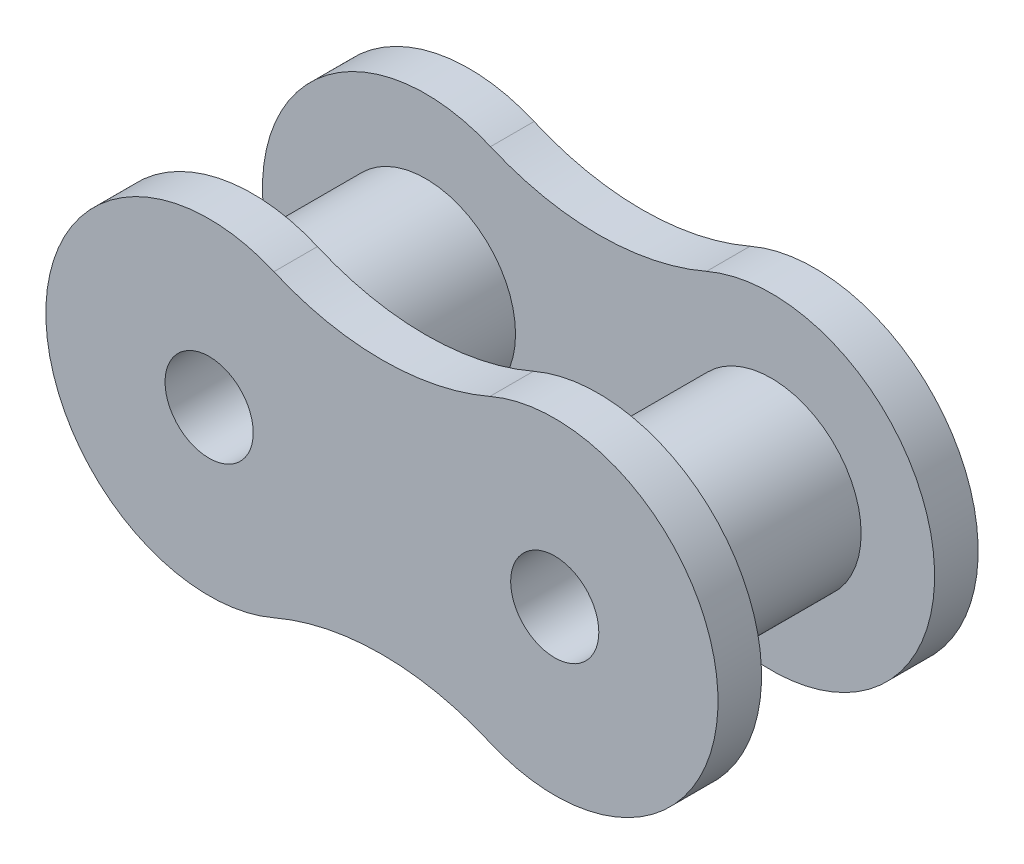
ISO-10303-21;
HEADER;
FILE_DESCRIPTION(('STEP AP214'),'2;1');
FILE_NAME('part.step','',(''),(''),'','','');
FILE_SCHEMA(('AUTOMOTIVE_DESIGN { 1 0 10303 214 1 1 1 1 }'));
ENDSEC;
DATA;
#1=APPLICATION_CONTEXT('core data for automotive mechanical design processes');
#2=APPLICATION_PROTOCOL_DEFINITION('international standard','automotive_design',2000,#1);
#3=PRODUCT_CONTEXT('',#1,'mechanical');
#4=PRODUCT('Part','Part','',(#3));
#5=PRODUCT_RELATED_PRODUCT_CATEGORY('part','',(#4));
#6=PRODUCT_DEFINITION_FORMATION('','',#4);
#7=PRODUCT_DEFINITION_CONTEXT('part definition',#1,'design');
#8=PRODUCT_DEFINITION('design','',#6,#7);
#9=PRODUCT_DEFINITION_SHAPE('','',#8);
#10=(LENGTH_UNIT() NAMED_UNIT(*) SI_UNIT(.MILLI.,.METRE.));
#11=(NAMED_UNIT(*) PLANE_ANGLE_UNIT() SI_UNIT($,.RADIAN.));
#12=(NAMED_UNIT(*) SI_UNIT($,.STERADIAN.) SOLID_ANGLE_UNIT());
#13=UNCERTAINTY_MEASURE_WITH_UNIT(LENGTH_MEASURE(1.E-05),#10,'distance_accuracy_value','');
#14=(GEOMETRIC_REPRESENTATION_CONTEXT(3) GLOBAL_UNCERTAINTY_ASSIGNED_CONTEXT((#13)) GLOBAL_UNIT_ASSIGNED_CONTEXT((#10,
#11,#12)) REPRESENTATION_CONTEXT('',''));
#15=CARTESIAN_POINT('',(0.,0.,0.));
#16=DIRECTION('',(0.,0.,1.));
#17=DIRECTION('',(1.,0.,0.));
#18=AXIS2_PLACEMENT_3D('',#15,#16,#17);
#19=CARTESIAN_POINT('',(3.175,7.34298134275173,0.8));
#20=DIRECTION('',(0.,0.,-1.));
#21=DIRECTION('',(-1.,0.,0.));
#22=AXIS2_PLACEMENT_3D('',#19,#20,#21);
#23=CYLINDRICAL_SURFACE('',#22,5.);
#24=CARTESIAN_POINT('',(3.175,7.34298134275173,0.));
#25=DIRECTION('',(0.,0.,-1.));
#26=DIRECTION('',(1.,0.,0.));
#27=AXIS2_PLACEMENT_3D('',#24,#25,#26);
#28=CIRCLE('',#27,5.);
#29=CARTESIAN_POINT('',(5.159375,2.7536180035319,0.));
#30=VERTEX_POINT('',#29);
#31=CARTESIAN_POINT('',(1.190625,2.7536180035319,0.));
#32=VERTEX_POINT('',#31);
#33=EDGE_CURVE('E146',#30,#32,#28,.T.);
#34=ORIENTED_EDGE('',*,*,#33,.T.);
#35=DIRECTION('',(0.,0.,-1.));
#36=VECTOR('',#35,1.);
#37=CARTESIAN_POINT('',(1.190625,2.7536180035319,0.8));
#38=LINE('',#37,#36);
#39=CARTESIAN_POINT('',(1.190625,2.7536180035319,0.8));
#40=VERTEX_POINT('',#39);
#41=EDGE_CURVE('E165',#40,#32,#38,.T.);
#42=ORIENTED_EDGE('',*,*,#41,.F.);
#43=CARTESIAN_POINT('',(3.175,7.34298134275173,0.8));
#44=DIRECTION('',(0.,0.,-1.));
#45=DIRECTION('',(1.,0.,0.));
#46=AXIS2_PLACEMENT_3D('',#43,#44,#45);
#47=CIRCLE('',#46,5.);
#48=CARTESIAN_POINT('',(5.159375,2.7536180035319,0.8));
#49=VERTEX_POINT('',#48);
#50=EDGE_CURVE('E147',#49,#40,#47,.T.);
#51=ORIENTED_EDGE('',*,*,#50,.F.);
#52=DIRECTION('',(0.,0.,-1.));
#53=VECTOR('',#52,1.);
#54=CARTESIAN_POINT('',(5.159375,2.7536180035319,0.8));
#55=LINE('',#54,#53);
#56=EDGE_CURVE('E153',#49,#30,#55,.T.);
#57=ORIENTED_EDGE('',*,*,#56,.T.);
#58=EDGE_LOOP('',(#34,#42,#51,#57));
#59=FACE_BOUND('',#58,.T.);
#60=ADVANCED_FACE('F35',(#59),#23,.F.);
#61=CARTESIAN_POINT('',(0.,0.,0.8));
#62=DIRECTION('',(0.,0.,-1.));
#63=DIRECTION('',(-1.,0.,0.));
#64=AXIS2_PLACEMENT_3D('',#61,#62,#63);
#65=CYLINDRICAL_SURFACE('',#64,3.);
#66=CARTESIAN_POINT('',(0.,0.,0.));
#67=DIRECTION('',(0.,0.,1.));
#68=DIRECTION('',(1.,0.,0.));
#69=AXIS2_PLACEMENT_3D('',#66,#67,#68);
#70=CIRCLE('',#69,3.);
#71=CARTESIAN_POINT('',(1.190625,-2.7536180035319,0.));
#72=VERTEX_POINT('',#71);
#73=EDGE_CURVE('E156',#32,#72,#70,.T.);
#74=ORIENTED_EDGE('',*,*,#73,.T.);
#75=DIRECTION('',(0.,0.,-1.));
#76=VECTOR('',#75,1.);
#77=CARTESIAN_POINT('',(1.190625,-2.7536180035319,0.8));
#78=LINE('',#77,#76);
#79=CARTESIAN_POINT('',(1.190625,-2.7536180035319,0.8));
#80=VERTEX_POINT('',#79);
#81=EDGE_CURVE('E163',#80,#72,#78,.T.);
#82=ORIENTED_EDGE('',*,*,#81,.F.);
#83=CARTESIAN_POINT('',(0.,0.,0.8));
#84=DIRECTION('',(0.,0.,1.));
#85=DIRECTION('',(1.,0.,0.));
#86=AXIS2_PLACEMENT_3D('',#83,#84,#85);
#87=CIRCLE('',#86,3.);
#88=EDGE_CURVE('E83',#40,#80,#87,.T.);
#89=ORIENTED_EDGE('',*,*,#88,.F.);
#90=ORIENTED_EDGE('',*,*,#41,.T.);
#91=EDGE_LOOP('',(#74,#82,#89,#90));
#92=FACE_BOUND('',#91,.T.);
#93=ADVANCED_FACE('F184',(#92),#65,.T.);
#94=CARTESIAN_POINT('',(3.175,-7.34298134275173,0.8));
#95=DIRECTION('',(0.,0.,-1.));
#96=DIRECTION('',(-1.,0.,0.));
#97=AXIS2_PLACEMENT_3D('',#94,#95,#96);
#98=CYLINDRICAL_SURFACE('',#97,5.);
#99=CARTESIAN_POINT('',(3.175,-7.34298134275173,0.));
#100=DIRECTION('',(0.,0.,-1.));
#101=DIRECTION('',(-1.,0.,0.));
#102=AXIS2_PLACEMENT_3D('',#99,#100,#101);
#103=CIRCLE('',#102,5.);
#104=CARTESIAN_POINT('',(5.159375,-2.7536180035319,0.));
#105=VERTEX_POINT('',#104);
#106=EDGE_CURVE('E69',#72,#105,#103,.T.);
#107=ORIENTED_EDGE('',*,*,#106,.T.);
#108=DIRECTION('',(0.,0.,-1.));
#109=VECTOR('',#108,1.);
#110=CARTESIAN_POINT('',(5.159375,-2.7536180035319,0.8));
#111=LINE('',#110,#109);
#112=CARTESIAN_POINT('',(5.159375,-2.7536180035319,0.8));
#113=VERTEX_POINT('',#112);
#114=EDGE_CURVE('E161',#113,#105,#111,.T.);
#115=ORIENTED_EDGE('',*,*,#114,.F.);
#116=CARTESIAN_POINT('',(3.175,-7.34298134275173,0.8));
#117=DIRECTION('',(0.,0.,-1.));
#118=DIRECTION('',(-1.,0.,0.));
#119=AXIS2_PLACEMENT_3D('',#116,#117,#118);
#120=CIRCLE('',#119,5.);
#121=EDGE_CURVE('E150',#80,#113,#120,.T.);
#122=ORIENTED_EDGE('',*,*,#121,.F.);
#123=ORIENTED_EDGE('',*,*,#81,.T.);
#124=EDGE_LOOP('',(#107,#115,#122,#123));
#125=FACE_BOUND('',#124,.T.);
#126=ADVANCED_FACE('F183',(#125),#98,.F.);
#127=CARTESIAN_POINT('',(6.35,0.,0.8));
#128=DIRECTION('',(0.,0.,-1.));
#129=DIRECTION('',(-1.,0.,0.));
#130=AXIS2_PLACEMENT_3D('',#127,#128,#129);
#131=CYLINDRICAL_SURFACE('',#130,3.);
#132=CARTESIAN_POINT('',(6.35,0.,0.));
#133=DIRECTION('',(0.,0.,1.));
#134=DIRECTION('',(1.,0.,0.));
#135=AXIS2_PLACEMENT_3D('',#132,#133,#134);
#136=CIRCLE('',#135,3.);
#137=EDGE_CURVE('E75',#105,#30,#136,.T.);
#138=ORIENTED_EDGE('',*,*,#137,.T.);
#139=ORIENTED_EDGE('',*,*,#56,.F.);
#140=CARTESIAN_POINT('',(6.35,0.,0.8));
#141=DIRECTION('',(0.,0.,1.));
#142=DIRECTION('',(1.,0.,0.));
#143=AXIS2_PLACEMENT_3D('',#140,#141,#142);
#144=CIRCLE('',#143,3.);
#145=EDGE_CURVE('E51',#113,#49,#144,.T.);
#146=ORIENTED_EDGE('',*,*,#145,.F.);
#147=ORIENTED_EDGE('',*,*,#114,.T.);
#148=EDGE_LOOP('',(#138,#139,#146,#147));
#149=FACE_BOUND('',#148,.T.);
#150=ADVANCED_FACE('F181',(#149),#131,.T.);
#151=CARTESIAN_POINT('',(4.7625,3.67149067137587,0.8));
#152=DIRECTION('',(0.,0.,1.));
#153=DIRECTION('',(1.,0.,0.));
#154=AXIS2_PLACEMENT_3D('',#151,#152,#153);
#155=PLANE('',#154);
#156=CARTESIAN_POINT('',(6.35,0.,0.8));
#157=DIRECTION('',(0.,0.,1.));
#158=DIRECTION('',(1.,0.,0.));
#159=AXIS2_PLACEMENT_3D('',#156,#157,#158);
#160=CIRCLE('',#159,0.81);
#161=CARTESIAN_POINT('',(7.16,0.,0.8));
#162=VERTEX_POINT('',#161);
#163=EDGE_CURVE('E235',#162,#162,#160,.T.);
#164=ORIENTED_EDGE('',*,*,#163,.F.);
#165=EDGE_LOOP('',(#164));
#166=FACE_BOUND('',#165,.T.);
#167=CARTESIAN_POINT('',(0.,0.,0.8));
#168=DIRECTION('',(0.,0.,1.));
#169=DIRECTION('',(1.,0.,0.));
#170=AXIS2_PLACEMENT_3D('',#167,#168,#169);
#171=CIRCLE('',#170,0.81);
#172=CARTESIAN_POINT('',(0.81,0.,0.8));
#173=VERTEX_POINT('',#172);
#174=EDGE_CURVE('E239',#173,#173,#171,.T.);
#175=ORIENTED_EDGE('',*,*,#174,.F.);
#176=EDGE_LOOP('',(#175));
#177=FACE_BOUND('',#176,.T.);
#178=ORIENTED_EDGE('',*,*,#50,.T.);
#179=ORIENTED_EDGE('',*,*,#88,.T.);
#180=ORIENTED_EDGE('',*,*,#121,.T.);
#181=ORIENTED_EDGE('',*,*,#145,.T.);
#182=EDGE_LOOP('',(#178,#179,#180,#181));
#183=FACE_BOUND('',#182,.T.);
#184=ADVANCED_FACE('F174',(#166,#177,#183),#155,.T.);
#185=CARTESIAN_POINT('',(4.7625,3.67149067137587,0.));
#186=DIRECTION('',(0.,0.,1.));
#187=DIRECTION('',(1.,0.,0.));
#188=AXIS2_PLACEMENT_3D('',#185,#186,#187);
#189=PLANE('',#188);
#190=CARTESIAN_POINT('',(0.,0.,0.));
#191=DIRECTION('',(0.,0.,1.));
#192=DIRECTION('',(1.,0.,0.));
#193=AXIS2_PLACEMENT_3D('',#190,#191,#192);
#194=CIRCLE('',#193,1.65);
#195=CARTESIAN_POINT('',(1.65,0.,0.));
#196=VERTEX_POINT('',#195);
#197=EDGE_CURVE('E11',#196,#196,#194,.F.);
#198=ORIENTED_EDGE('',*,*,#197,.F.);
#199=EDGE_LOOP('',(#198));
#200=FACE_BOUND('',#199,.T.);
#201=CARTESIAN_POINT('',(6.35,0.,0.));
#202=DIRECTION('',(0.,0.,1.));
#203=DIRECTION('',(1.,0.,0.));
#204=AXIS2_PLACEMENT_3D('',#201,#202,#203);
#205=CIRCLE('',#204,1.65);
#206=CARTESIAN_POINT('',(8.,0.,0.));
#207=VERTEX_POINT('',#206);
#208=EDGE_CURVE('E43',#207,#207,#205,.F.);
#209=ORIENTED_EDGE('',*,*,#208,.F.);
#210=EDGE_LOOP('',(#209));
#211=FACE_BOUND('',#210,.T.);
#212=ORIENTED_EDGE('',*,*,#33,.F.);
#213=ORIENTED_EDGE('',*,*,#137,.F.);
#214=ORIENTED_EDGE('',*,*,#106,.F.);
#215=ORIENTED_EDGE('',*,*,#73,.F.);
#216=EDGE_LOOP('',(#212,#213,#214,#215));
#217=FACE_BOUND('',#216,.T.);
#218=ADVANCED_FACE('F171',(#200,#211,#217),#189,.F.);
#219=CARTESIAN_POINT('',(6.35,0.,-3.18));
#220=DIRECTION('',(0.,0.,1.));
#221=DIRECTION('',(1.,0.,0.));
#222=AXIS2_PLACEMENT_3D('',#219,#220,#221);
#223=CYLINDRICAL_SURFACE('',#222,1.65);
#224=CARTESIAN_POINT('',(6.35,0.,-3.18));
#225=DIRECTION('',(0.,0.,-1.));
#226=DIRECTION('',(-1.,0.,0.));
#227=AXIS2_PLACEMENT_3D('',#224,#225,#226);
#228=CIRCLE('',#227,1.65);
#229=CARTESIAN_POINT('',(8.,0.,-3.18));
#230=VERTEX_POINT('',#229);
#231=EDGE_CURVE('E138',#230,#230,#228,.T.);
#232=CARTESIAN_POINT('',(8.,0.,-3.18));
#233=CARTESIAN_POINT('',(8.,0.,-3.146875));
#234=CARTESIAN_POINT('',(8.,0.,-3.11375));
#235=CARTESIAN_POINT('',(8.,0.,-3.0475));
#236=CARTESIAN_POINT('',(8.,0.,-3.014375));
#237=CARTESIAN_POINT('',(8.,0.,-2.948125));
#238=CARTESIAN_POINT('',(8.,0.,-2.915));
#239=CARTESIAN_POINT('',(8.,0.,-2.84875));
#240=CARTESIAN_POINT('',(8.,0.,-2.815625));
#241=CARTESIAN_POINT('',(8.,0.,-2.749375));
#242=CARTESIAN_POINT('',(8.,0.,-2.71625));
#243=CARTESIAN_POINT('',(8.,0.,-2.65));
#244=CARTESIAN_POINT('',(8.,0.,-2.616875));
#245=CARTESIAN_POINT('',(8.,0.,-2.550625));
#246=CARTESIAN_POINT('',(8.,0.,-2.5175));
#247=CARTESIAN_POINT('',(8.,0.,-2.45125));
#248=CARTESIAN_POINT('',(8.,0.,-2.418125));
#249=CARTESIAN_POINT('',(8.,0.,-2.351875));
#250=CARTESIAN_POINT('',(8.,0.,-2.31875));
#251=CARTESIAN_POINT('',(8.,0.,-2.2525));
#252=CARTESIAN_POINT('',(8.,0.,-2.219375));
#253=CARTESIAN_POINT('',(8.,0.,-2.153125));
#254=CARTESIAN_POINT('',(8.,0.,-2.12));
#255=CARTESIAN_POINT('',(8.,0.,-2.05375));
#256=CARTESIAN_POINT('',(8.,0.,-2.020625));
#257=CARTESIAN_POINT('',(8.,0.,-1.954375));
#258=CARTESIAN_POINT('',(8.,0.,-1.92125));
#259=CARTESIAN_POINT('',(8.,0.,-1.855));
#260=CARTESIAN_POINT('',(8.,0.,-1.821875));
#261=CARTESIAN_POINT('',(8.,0.,-1.755625));
#262=CARTESIAN_POINT('',(8.,0.,-1.7225));
#263=CARTESIAN_POINT('',(8.,0.,-1.65625));
#264=CARTESIAN_POINT('',(8.,0.,-1.623125));
#265=CARTESIAN_POINT('',(8.,0.,-1.556875));
#266=CARTESIAN_POINT('',(8.,0.,-1.52375));
#267=CARTESIAN_POINT('',(8.,0.,-1.4575));
#268=CARTESIAN_POINT('',(8.,0.,-1.424375));
#269=CARTESIAN_POINT('',(8.,0.,-1.358125));
#270=CARTESIAN_POINT('',(8.,0.,-1.325));
#271=CARTESIAN_POINT('',(8.,0.,-1.25875));
#272=CARTESIAN_POINT('',(8.,0.,-1.225625));
#273=CARTESIAN_POINT('',(8.,0.,-1.159375));
#274=CARTESIAN_POINT('',(8.,0.,-1.12625));
#275=CARTESIAN_POINT('',(8.,0.,-1.06));
#276=CARTESIAN_POINT('',(8.,0.,-1.026875));
#277=CARTESIAN_POINT('',(8.,0.,-0.960625));
#278=CARTESIAN_POINT('',(8.,0.,-0.9275));
#279=CARTESIAN_POINT('',(8.,0.,-0.86125));
#280=CARTESIAN_POINT('',(8.,0.,-0.828125));
#281=CARTESIAN_POINT('',(8.,0.,-0.761875));
#282=CARTESIAN_POINT('',(8.,0.,-0.72875));
#283=CARTESIAN_POINT('',(8.,0.,-0.6625));
#284=CARTESIAN_POINT('',(8.,0.,-0.629375));
#285=CARTESIAN_POINT('',(8.,0.,-0.563125));
#286=CARTESIAN_POINT('',(8.,0.,-0.53));
#287=CARTESIAN_POINT('',(8.,0.,-0.46375));
#288=CARTESIAN_POINT('',(8.,0.,-0.430625));
#289=CARTESIAN_POINT('',(8.,0.,-0.364375));
#290=CARTESIAN_POINT('',(8.,0.,-0.33125));
#291=CARTESIAN_POINT('',(8.,0.,-0.265));
#292=CARTESIAN_POINT('',(8.,0.,-0.231875));
#293=CARTESIAN_POINT('',(8.,0.,-0.165625));
#294=CARTESIAN_POINT('',(8.,0.,-0.1325));
#295=CARTESIAN_POINT('',(8.,0.,-0.06625));
#296=CARTESIAN_POINT('',(8.,0.,-0.033125));
#297=CARTESIAN_POINT('',(8.,0.,0.));
#298=B_SPLINE_CURVE_WITH_KNOTS('',3,(#232,#233,#234,#235,#236,#237,#238,#239,#240,#241,#242,
#243,#244,#245,#246,#247,#248,#249,#250,#251,#252,#253,#254,#255,#256,#257,#258,#259,#260,#261,
#262,#263,#264,#265,#266,#267,#268,#269,#270,#271,#272,#273,#274,#275,#276,#277,#278,#279,#280,
#281,#282,#283,#284,#285,#286,#287,#288,#289,#290,#291,#292,#293,#294,#295,#296,#297),
.UNSPECIFIED.,.F.,.F.,(4,2,2,2,2,2,2,2,2,2,2,2,2,2,2,2,2,2,2,2,2,2,2,2,2,2,2,2,2,2,2,2,4),(0.,
0.0993749999999996,0.19875,0.298125,0.3975,0.496875,0.59625,0.695625,0.795,0.894375,0.99375,
1.093125,1.1925,1.291875,1.39125,1.490625,1.59,1.689375,1.78875,1.888125,1.9875,2.086875,
2.18625,2.285625,2.385,2.484375,2.58375,2.683125,2.7825,2.881875,2.98125,3.080625,3.18),.UNSPECIFIED.);
#299=EDGE_CURVE('BSEAM169',#230,#207,#298,.T.);
#300=ORIENTED_EDGE('',*,*,#231,.F.);
#301=ORIENTED_EDGE('',*,*,#208,.T.);
#302=ORIENTED_EDGE('',*,*,#299,.T.);
#303=ORIENTED_EDGE('',*,*,#299,.F.);
#304=EDGE_LOOP('',(#300,#302,#301,#303));
#305=FACE_BOUND('',#304,.T.);
#306=ADVANCED_FACE('F169',(#305),#223,.T.);
#307=CARTESIAN_POINT('',(0.,0.,-3.18));
#308=DIRECTION('',(0.,0.,1.));
#309=DIRECTION('',(1.,0.,0.));
#310=AXIS2_PLACEMENT_3D('',#307,#308,#309);
#311=CYLINDRICAL_SURFACE('',#310,1.65);
#312=CARTESIAN_POINT('',(0.,0.,-3.18));
#313=DIRECTION('',(0.,0.,-1.));
#314=DIRECTION('',(-1.,0.,0.));
#315=AXIS2_PLACEMENT_3D('',#312,#313,#314);
#316=CIRCLE('',#315,1.65);
#317=CARTESIAN_POINT('',(1.65,0.,-3.18));
#318=VERTEX_POINT('',#317);
#319=EDGE_CURVE('E135',#318,#318,#316,.T.);
#320=CARTESIAN_POINT('',(1.65,0.,-3.18));
#321=CARTESIAN_POINT('',(1.65,0.,-3.146875));
#322=CARTESIAN_POINT('',(1.65,0.,-3.11375));
#323=CARTESIAN_POINT('',(1.65,0.,-3.0475));
#324=CARTESIAN_POINT('',(1.65,0.,-3.014375));
#325=CARTESIAN_POINT('',(1.65,0.,-2.948125));
#326=CARTESIAN_POINT('',(1.65,0.,-2.915));
#327=CARTESIAN_POINT('',(1.65,0.,-2.84875));
#328=CARTESIAN_POINT('',(1.65,0.,-2.815625));
#329=CARTESIAN_POINT('',(1.65,0.,-2.749375));
#330=CARTESIAN_POINT('',(1.65,0.,-2.71625));
#331=CARTESIAN_POINT('',(1.65,0.,-2.65));
#332=CARTESIAN_POINT('',(1.65,0.,-2.616875));
#333=CARTESIAN_POINT('',(1.65,0.,-2.550625));
#334=CARTESIAN_POINT('',(1.65,0.,-2.5175));
#335=CARTESIAN_POINT('',(1.65,0.,-2.45125));
#336=CARTESIAN_POINT('',(1.65,0.,-2.418125));
#337=CARTESIAN_POINT('',(1.65,0.,-2.351875));
#338=CARTESIAN_POINT('',(1.65,0.,-2.31875));
#339=CARTESIAN_POINT('',(1.65,0.,-2.2525));
#340=CARTESIAN_POINT('',(1.65,0.,-2.219375));
#341=CARTESIAN_POINT('',(1.65,0.,-2.153125));
#342=CARTESIAN_POINT('',(1.65,0.,-2.12));
#343=CARTESIAN_POINT('',(1.65,0.,-2.05375));
#344=CARTESIAN_POINT('',(1.65,0.,-2.020625));
#345=CARTESIAN_POINT('',(1.65,0.,-1.954375));
#346=CARTESIAN_POINT('',(1.65,0.,-1.92125));
#347=CARTESIAN_POINT('',(1.65,0.,-1.855));
#348=CARTESIAN_POINT('',(1.65,0.,-1.821875));
#349=CARTESIAN_POINT('',(1.65,0.,-1.755625));
#350=CARTESIAN_POINT('',(1.65,0.,-1.7225));
#351=CARTESIAN_POINT('',(1.65,0.,-1.65625));
#352=CARTESIAN_POINT('',(1.65,0.,-1.623125));
#353=CARTESIAN_POINT('',(1.65,0.,-1.556875));
#354=CARTESIAN_POINT('',(1.65,0.,-1.52375));
#355=CARTESIAN_POINT('',(1.65,0.,-1.4575));
#356=CARTESIAN_POINT('',(1.65,0.,-1.424375));
#357=CARTESIAN_POINT('',(1.65,0.,-1.358125));
#358=CARTESIAN_POINT('',(1.65,0.,-1.325));
#359=CARTESIAN_POINT('',(1.65,0.,-1.25875));
#360=CARTESIAN_POINT('',(1.65,0.,-1.225625));
#361=CARTESIAN_POINT('',(1.65,0.,-1.159375));
#362=CARTESIAN_POINT('',(1.65,0.,-1.12625));
#363=CARTESIAN_POINT('',(1.65,0.,-1.06));
#364=CARTESIAN_POINT('',(1.65,0.,-1.026875));
#365=CARTESIAN_POINT('',(1.65,0.,-0.960625));
#366=CARTESIAN_POINT('',(1.65,0.,-0.9275));
#367=CARTESIAN_POINT('',(1.65,0.,-0.86125));
#368=CARTESIAN_POINT('',(1.65,0.,-0.828125));
#369=CARTESIAN_POINT('',(1.65,0.,-0.761875));
#370=CARTESIAN_POINT('',(1.65,0.,-0.72875));
#371=CARTESIAN_POINT('',(1.65,0.,-0.6625));
#372=CARTESIAN_POINT('',(1.65,0.,-0.629375));
#373=CARTESIAN_POINT('',(1.65,0.,-0.563125));
#374=CARTESIAN_POINT('',(1.65,0.,-0.53));
#375=CARTESIAN_POINT('',(1.65,0.,-0.46375));
#376=CARTESIAN_POINT('',(1.65,0.,-0.430625));
#377=CARTESIAN_POINT('',(1.65,0.,-0.364375));
#378=CARTESIAN_POINT('',(1.65,0.,-0.33125));
#379=CARTESIAN_POINT('',(1.65,0.,-0.265));
#380=CARTESIAN_POINT('',(1.65,0.,-0.231875));
#381=CARTESIAN_POINT('',(1.65,0.,-0.165625));
#382=CARTESIAN_POINT('',(1.65,0.,-0.1325));
#383=CARTESIAN_POINT('',(1.65,0.,-0.06625));
#384=CARTESIAN_POINT('',(1.65,0.,-0.033125));
#385=CARTESIAN_POINT('',(1.65,0.,0.));
#386=B_SPLINE_CURVE_WITH_KNOTS('',3,(#320,#321,#322,#323,#324,#325,#326,#327,#328,#329,#330,
#331,#332,#333,#334,#335,#336,#337,#338,#339,#340,#341,#342,#343,#344,#345,#346,#347,#348,#349,
#350,#351,#352,#353,#354,#355,#356,#357,#358,#359,#360,#361,#362,#363,#364,#365,#366,#367,#368,
#369,#370,#371,#372,#373,#374,#375,#376,#377,#378,#379,#380,#381,#382,#383,#384,#385),
.UNSPECIFIED.,.F.,.F.,(4,2,2,2,2,2,2,2,2,2,2,2,2,2,2,2,2,2,2,2,2,2,2,2,2,2,2,2,2,2,2,2,4),(0.,
0.0993749999999996,0.19875,0.298125,0.3975,0.496875,0.59625,0.695625,0.795,0.894375,0.99375,
1.093125,1.1925,1.291875,1.39125,1.490625,1.59,1.689375,1.78875,1.888125,1.9875,2.086875,
2.18625,2.285625,2.385,2.484375,2.58375,2.683125,2.7825,2.881875,2.98125,3.080625,3.18),.UNSPECIFIED.);
#387=EDGE_CURVE('BSEAM199',#318,#196,#386,.T.);
#388=ORIENTED_EDGE('',*,*,#319,.F.);
#389=ORIENTED_EDGE('',*,*,#197,.T.);
#390=ORIENTED_EDGE('',*,*,#387,.T.);
#391=ORIENTED_EDGE('',*,*,#387,.F.);
#392=EDGE_LOOP('',(#388,#390,#389,#391));
#393=FACE_BOUND('',#392,.T.);
#394=ADVANCED_FACE('F199',(#393),#311,.T.);
#395=CARTESIAN_POINT('',(0.,0.,-3.98));
#396=DIRECTION('',(0.,0.,1.));
#397=DIRECTION('',(1.,0.,0.));
#398=AXIS2_PLACEMENT_3D('',#395,#396,#397);
#399=CYLINDRICAL_SURFACE('',#398,3.);
#400=CARTESIAN_POINT('',(0.,0.,-3.18));
#401=DIRECTION('',(0.,0.,-1.));
#402=DIRECTION('',(-1.,0.,0.));
#403=AXIS2_PLACEMENT_3D('',#400,#401,#402);
#404=CIRCLE('',#403,3.);
#405=CARTESIAN_POINT('',(1.190625,-2.7536180035319,-3.18));
#406=VERTEX_POINT('',#405);
#407=CARTESIAN_POINT('',(1.190625,2.7536180035319,-3.18));
#408=VERTEX_POINT('',#407);
#409=EDGE_CURVE('E134',#406,#408,#404,.T.);
#410=ORIENTED_EDGE('',*,*,#409,.T.);
#411=DIRECTION('',(0.,0.,1.));
#412=VECTOR('',#411,1.);
#413=CARTESIAN_POINT('',(1.190625,2.7536180035319,-3.98));
#414=LINE('',#413,#412);
#415=CARTESIAN_POINT('',(1.190625,2.7536180035319,-3.98));
#416=VERTEX_POINT('',#415);
#417=EDGE_CURVE('E114',#416,#408,#414,.T.);
#418=ORIENTED_EDGE('',*,*,#417,.F.);
#419=CARTESIAN_POINT('',(0.,0.,-3.98));
#420=DIRECTION('',(0.,0.,-1.));
#421=DIRECTION('',(-1.,0.,0.));
#422=AXIS2_PLACEMENT_3D('',#419,#420,#421);
#423=CIRCLE('',#422,3.);
#424=CARTESIAN_POINT('',(1.190625,-2.7536180035319,-3.98));
#425=VERTEX_POINT('',#424);
#426=EDGE_CURVE('E121',#425,#416,#423,.T.);
#427=ORIENTED_EDGE('',*,*,#426,.F.);
#428=DIRECTION('',(0.,0.,1.));
#429=VECTOR('',#428,1.);
#430=CARTESIAN_POINT('',(1.190625,-2.7536180035319,-3.98));
#431=LINE('',#430,#429);
#432=EDGE_CURVE('E250',#425,#406,#431,.T.);
#433=ORIENTED_EDGE('',*,*,#432,.T.);
#434=EDGE_LOOP('',(#410,#418,#427,#433));
#435=FACE_BOUND('',#434,.T.);
#436=ADVANCED_FACE('F132',(#435),#399,.T.);
#437=CARTESIAN_POINT('',(3.175,7.34298134275173,-3.98));
#438=DIRECTION('',(0.,0.,1.));
#439=DIRECTION('',(1.,0.,0.));
#440=AXIS2_PLACEMENT_3D('',#437,#438,#439);
#441=CYLINDRICAL_SURFACE('',#440,5.);
#442=CARTESIAN_POINT('',(3.175,7.34298134275173,-3.18));
#443=DIRECTION('',(0.,0.,1.));
#444=DIRECTION('',(-1.,0.,0.));
#445=AXIS2_PLACEMENT_3D('',#442,#443,#444);
#446=CIRCLE('',#445,5.);
#447=CARTESIAN_POINT('',(5.159375,2.7536180035319,-3.18));
#448=VERTEX_POINT('',#447);
#449=EDGE_CURVE('E252',#408,#448,#446,.T.);
#450=ORIENTED_EDGE('',*,*,#449,.T.);
#451=DIRECTION('',(0.,0.,1.));
#452=VECTOR('',#451,1.);
#453=CARTESIAN_POINT('',(5.159375,2.7536180035319,-3.98));
#454=LINE('',#453,#452);
#455=CARTESIAN_POINT('',(5.159375,2.7536180035319,-3.98));
#456=VERTEX_POINT('',#455);
#457=EDGE_CURVE('E117',#456,#448,#454,.T.);
#458=ORIENTED_EDGE('',*,*,#457,.F.);
#459=CARTESIAN_POINT('',(3.175,7.34298134275173,-3.98));
#460=DIRECTION('',(0.,0.,1.));
#461=DIRECTION('',(-1.,0.,0.));
#462=AXIS2_PLACEMENT_3D('',#459,#460,#461);
#463=CIRCLE('',#462,5.);
#464=EDGE_CURVE('E110',#416,#456,#463,.T.);
#465=ORIENTED_EDGE('',*,*,#464,.F.);
#466=ORIENTED_EDGE('',*,*,#417,.T.);
#467=EDGE_LOOP('',(#450,#458,#465,#466));
#468=FACE_BOUND('',#467,.T.);
#469=ADVANCED_FACE('F112',(#468),#441,.F.);
#470=CARTESIAN_POINT('',(6.35,0.,-3.98));
#471=DIRECTION('',(0.,0.,1.));
#472=DIRECTION('',(1.,0.,0.));
#473=AXIS2_PLACEMENT_3D('',#470,#471,#472);
#474=CYLINDRICAL_SURFACE('',#473,3.);
#475=CARTESIAN_POINT('',(6.35,0.,-3.18));
#476=DIRECTION('',(0.,0.,-1.));
#477=DIRECTION('',(-1.,0.,0.));
#478=AXIS2_PLACEMENT_3D('',#475,#476,#477);
#479=CIRCLE('',#478,3.);
#480=CARTESIAN_POINT('',(5.159375,-2.7536180035319,-3.18));
#481=VERTEX_POINT('',#480);
#482=EDGE_CURVE('E254',#448,#481,#479,.T.);
#483=ORIENTED_EDGE('',*,*,#482,.T.);
#484=DIRECTION('',(0.,0.,1.));
#485=VECTOR('',#484,1.);
#486=CARTESIAN_POINT('',(5.159375,-2.7536180035319,-3.98));
#487=LINE('',#486,#485);
#488=CARTESIAN_POINT('',(5.159375,-2.7536180035319,-3.98));
#489=VERTEX_POINT('',#488);
#490=EDGE_CURVE('E140',#489,#481,#487,.T.);
#491=ORIENTED_EDGE('',*,*,#490,.F.);
#492=CARTESIAN_POINT('',(6.35,0.,-3.98));
#493=DIRECTION('',(0.,0.,-1.));
#494=DIRECTION('',(-1.,0.,0.));
#495=AXIS2_PLACEMENT_3D('',#492,#493,#494);
#496=CIRCLE('',#495,3.);
#497=EDGE_CURVE('E120',#456,#489,#496,.T.);
#498=ORIENTED_EDGE('',*,*,#497,.F.);
#499=ORIENTED_EDGE('',*,*,#457,.T.);
#500=EDGE_LOOP('',(#483,#491,#498,#499));
#501=FACE_BOUND('',#500,.T.);
#502=ADVANCED_FACE('F208',(#501),#474,.T.);
#503=CARTESIAN_POINT('',(3.175,-7.34298134275173,-3.98));
#504=DIRECTION('',(0.,0.,1.));
#505=DIRECTION('',(1.,0.,0.));
#506=AXIS2_PLACEMENT_3D('',#503,#504,#505);
#507=CYLINDRICAL_SURFACE('',#506,5.);
#508=CARTESIAN_POINT('',(3.175,-7.34298134275173,-3.18));
#509=DIRECTION('',(0.,0.,1.));
#510=DIRECTION('',(-1.,0.,0.));
#511=AXIS2_PLACEMENT_3D('',#508,#509,#510);
#512=CIRCLE('',#511,5.);
#513=EDGE_CURVE('E130',#481,#406,#512,.T.);
#514=ORIENTED_EDGE('',*,*,#513,.T.);
#515=ORIENTED_EDGE('',*,*,#432,.F.);
#516=CARTESIAN_POINT('',(3.175,-7.34298134275173,-3.98));
#517=DIRECTION('',(0.,0.,1.));
#518=DIRECTION('',(-1.,0.,0.));
#519=AXIS2_PLACEMENT_3D('',#516,#517,#518);
#520=CIRCLE('',#519,5.);
#521=EDGE_CURVE('E126',#489,#425,#520,.T.);
#522=ORIENTED_EDGE('',*,*,#521,.F.);
#523=ORIENTED_EDGE('',*,*,#490,.T.);
#524=EDGE_LOOP('',(#514,#515,#522,#523));
#525=FACE_BOUND('',#524,.T.);
#526=ADVANCED_FACE('F211',(#525),#507,.F.);
#527=CARTESIAN_POINT('',(1.5875,3.67149067137587,-3.98));
#528=DIRECTION('',(0.,0.,-1.));
#529=DIRECTION('',(-1.,0.,0.));
#530=AXIS2_PLACEMENT_3D('',#527,#528,#529);
#531=PLANE('',#530);
#532=CARTESIAN_POINT('',(6.35,0.,-3.98));
#533=DIRECTION('',(0.,0.,-1.));
#534=DIRECTION('',(-1.,0.,0.));
#535=AXIS2_PLACEMENT_3D('',#532,#533,#534);
#536=CIRCLE('',#535,0.81);
#537=CARTESIAN_POINT('',(5.54,0.,-3.98));
#538=VERTEX_POINT('',#537);
#539=EDGE_CURVE('E238',#538,#538,#536,.T.);
#540=ORIENTED_EDGE('',*,*,#539,.F.);
#541=EDGE_LOOP('',(#540));
#542=FACE_BOUND('',#541,.T.);
#543=CARTESIAN_POINT('',(0.,0.,-3.98));
#544=DIRECTION('',(0.,0.,-1.));
#545=DIRECTION('',(-1.,0.,0.));
#546=AXIS2_PLACEMENT_3D('',#543,#544,#545);
#547=CIRCLE('',#546,0.81);
#548=CARTESIAN_POINT('',(-0.81,0.,-3.98));
#549=VERTEX_POINT('',#548);
#550=EDGE_CURVE('E240',#549,#549,#547,.T.);
#551=ORIENTED_EDGE('',*,*,#550,.F.);
#552=EDGE_LOOP('',(#551));
#553=FACE_BOUND('',#552,.T.);
#554=ORIENTED_EDGE('',*,*,#426,.T.);
#555=ORIENTED_EDGE('',*,*,#464,.T.);
#556=ORIENTED_EDGE('',*,*,#497,.T.);
#557=ORIENTED_EDGE('',*,*,#521,.T.);
#558=EDGE_LOOP('',(#554,#555,#556,#557));
#559=FACE_BOUND('',#558,.T.);
#560=ADVANCED_FACE('F124',(#542,#553,#559),#531,.T.);
#561=CARTESIAN_POINT('',(1.5875,3.67149067137587,-3.18));
#562=DIRECTION('',(0.,0.,-1.));
#563=DIRECTION('',(-1.,0.,0.));
#564=AXIS2_PLACEMENT_3D('',#561,#562,#563);
#565=PLANE('',#564);
#566=ORIENTED_EDGE('',*,*,#231,.T.);
#567=EDGE_LOOP('',(#566));
#568=FACE_BOUND('',#567,.T.);
#569=ORIENTED_EDGE('',*,*,#319,.T.);
#570=EDGE_LOOP('',(#569));
#571=FACE_BOUND('',#570,.T.);
#572=ORIENTED_EDGE('',*,*,#409,.F.);
#573=ORIENTED_EDGE('',*,*,#513,.F.);
#574=ORIENTED_EDGE('',*,*,#482,.F.);
#575=ORIENTED_EDGE('',*,*,#449,.F.);
#576=EDGE_LOOP('',(#572,#573,#574,#575));
#577=FACE_BOUND('',#576,.T.);
#578=ADVANCED_FACE('F216',(#568,#571,#577),#565,.F.);
#579=CARTESIAN_POINT('',(0.,0.,0.82));
#580=DIRECTION('',(0.,0.,-1.));
#581=DIRECTION('',(-1.,0.,0.));
#582=AXIS2_PLACEMENT_3D('',#579,#580,#581);
#583=CYLINDRICAL_SURFACE('',#582,0.81);
#584=ORIENTED_EDGE('',*,*,#174,.T.);
#585=EDGE_LOOP('',(#584));
#586=FACE_BOUND('',#585,.T.);
#587=ORIENTED_EDGE('',*,*,#550,.T.);
#588=EDGE_LOOP('',(#587));
#589=FACE_BOUND('',#588,.T.);
#590=ADVANCED_FACE('F219',(#586,#589),#583,.F.);
#591=CARTESIAN_POINT('',(6.35,0.,0.82));
#592=DIRECTION('',(0.,0.,-1.));
#593=DIRECTION('',(-1.,0.,0.));
#594=AXIS2_PLACEMENT_3D('',#591,#592,#593);
#595=CYLINDRICAL_SURFACE('',#594,0.81);
#596=ORIENTED_EDGE('',*,*,#163,.T.);
#597=EDGE_LOOP('',(#596));
#598=FACE_BOUND('',#597,.T.);
#599=ORIENTED_EDGE('',*,*,#539,.T.);
#600=EDGE_LOOP('',(#599));
#601=FACE_BOUND('',#600,.T.);
#602=ADVANCED_FACE('F226',(#598,#601),#595,.F.);
#603=CLOSED_SHELL('',(#60,#93,#126,#150,#184,#218,#306,#394,#436,#469,#502,#526,#560,#578,#590,#602));
#604=MANIFOLD_SOLID_BREP('B2',#603);
#605=ADVANCED_BREP_SHAPE_REPRESENTATION('',(#18,#604),#14);
#606=SHAPE_DEFINITION_REPRESENTATION(#9,#605);
ENDSEC;
END-ISO-10303-21;
